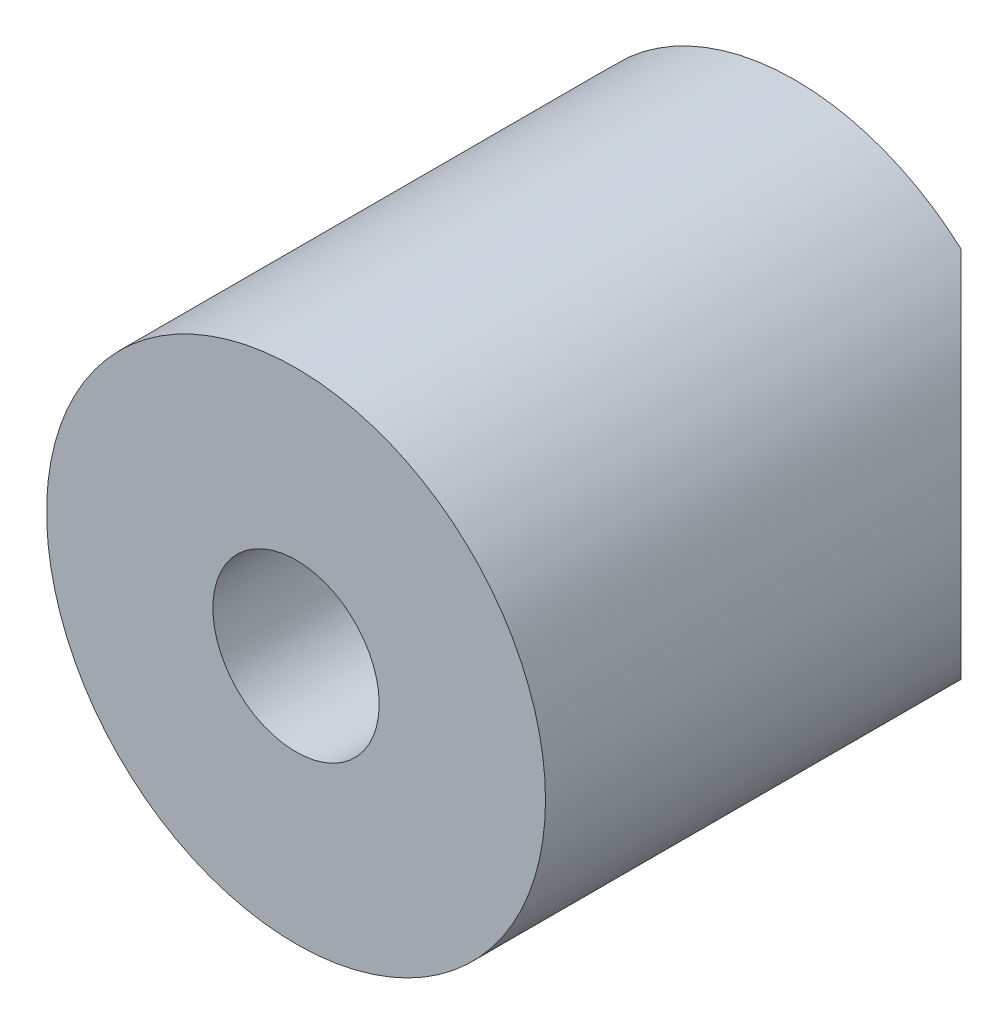
ISO-10303-21;
HEADER;
FILE_DESCRIPTION(('STEP AP214'),'2;1');
FILE_NAME('part.step','',(''),(''),'','','');
FILE_SCHEMA(('AUTOMOTIVE_DESIGN { 1 0 10303 214 1 1 1 1 }'));
ENDSEC;
DATA;
#1=APPLICATION_CONTEXT('core data for automotive mechanical design processes');
#2=APPLICATION_PROTOCOL_DEFINITION('international standard','automotive_design',2000,#1);
#3=PRODUCT_CONTEXT('',#1,'mechanical');
#4=PRODUCT('Part','Part','',(#3));
#5=PRODUCT_RELATED_PRODUCT_CATEGORY('part','',(#4));
#6=PRODUCT_DEFINITION_FORMATION('','',#4);
#7=PRODUCT_DEFINITION_CONTEXT('part definition',#1,'design');
#8=PRODUCT_DEFINITION('design','',#6,#7);
#9=PRODUCT_DEFINITION_SHAPE('','',#8);
#10=(LENGTH_UNIT() NAMED_UNIT(*) SI_UNIT(.MILLI.,.METRE.));
#11=(NAMED_UNIT(*) PLANE_ANGLE_UNIT() SI_UNIT($,.RADIAN.));
#12=(NAMED_UNIT(*) SI_UNIT($,.STERADIAN.) SOLID_ANGLE_UNIT());
#13=UNCERTAINTY_MEASURE_WITH_UNIT(LENGTH_MEASURE(1.E-05),#10,'distance_accuracy_value','');
#14=(GEOMETRIC_REPRESENTATION_CONTEXT(3) GLOBAL_UNCERTAINTY_ASSIGNED_CONTEXT((#13)) GLOBAL_UNIT_ASSIGNED_CONTEXT((#10,
#11,#12)) REPRESENTATION_CONTEXT('',''));
#15=CARTESIAN_POINT('',(0.,0.,0.));
#16=DIRECTION('',(0.,0.,1.));
#17=DIRECTION('',(1.,0.,0.));
#18=AXIS2_PLACEMENT_3D('',#15,#16,#17);
#19=CARTESIAN_POINT('',(0.,0.,-76.2));
#20=DIRECTION('',(0.,0.,1.));
#21=DIRECTION('',(1.,0.,0.));
#22=AXIS2_PLACEMENT_3D('',#19,#20,#21);
#23=CYLINDRICAL_SURFACE('',#22,38.1);
#24=CARTESIAN_POINT('',(0.,0.,-101.6));
#25=DIRECTION('',(0.707106781186543,0.,0.707106781186552));
#26=DIRECTION('',(-0.707106781186552,0.,0.707106781186543));
#27=AXIS2_PLACEMENT_3D('',#24,#25,#26);
#28=ELLIPSE('',#27,53.8815367264146,38.1);
#29=CARTESIAN_POINT('',(-25.4,-28.3980633142473,-76.2));
#30=VERTEX_POINT('',#29);
#31=CARTESIAN_POINT('',(-25.4,28.3980633142473,-76.2));
#32=VERTEX_POINT('',#31);
#33=EDGE_CURVE('E53',#30,#32,#28,.F.);
#34=ORIENTED_EDGE('',*,*,#33,.F.);
#35=CARTESIAN_POINT('',(0.,0.,-76.2));
#36=DIRECTION('',(0.,0.,1.));
#37=DIRECTION('',(1.,0.,0.));
#38=AXIS2_PLACEMENT_3D('',#35,#36,#37);
#39=CIRCLE('',#38,38.1);
#40=CARTESIAN_POINT('',(25.4,-28.3980633142473,-76.2));
#41=VERTEX_POINT('',#40);
#42=EDGE_CURVE('E64',#30,#41,#39,.T.);
#43=ORIENTED_EDGE('',*,*,#42,.T.);
#44=CARTESIAN_POINT('',(0.,0.,-101.6));
#45=DIRECTION('',(-0.707106781186543,0.,0.707106781186552));
#46=DIRECTION('',(0.707106781186552,0.,0.707106781186543));
#47=AXIS2_PLACEMENT_3D('',#44,#45,#46);
#48=ELLIPSE('',#47,53.8815367264146,38.1);
#49=CARTESIAN_POINT('',(25.4,28.3980633142473,-76.2));
#50=VERTEX_POINT('',#49);
#51=EDGE_CURVE('E46',#50,#41,#48,.F.);
#52=ORIENTED_EDGE('',*,*,#51,.F.);
#53=EDGE_CURVE('E62',#50,#32,#39,.T.);
#54=ORIENTED_EDGE('',*,*,#53,.T.);
#55=EDGE_LOOP('',(#34,#43,#52,#54));
#56=FACE_BOUND('',#55,.T.);
#57=CARTESIAN_POINT('',(0.,0.,0.));
#58=DIRECTION('',(0.,0.,1.));
#59=DIRECTION('',(1.,0.,0.));
#60=AXIS2_PLACEMENT_3D('',#57,#58,#59);
#61=CIRCLE('',#60,38.1);
#62=CARTESIAN_POINT('',(38.1,0.,0.));
#63=VERTEX_POINT('',#62);
#64=EDGE_CURVE('E70',#63,#63,#61,.T.);
#65=ORIENTED_EDGE('',*,*,#64,.F.);
#66=EDGE_LOOP('',(#65));
#67=FACE_BOUND('',#66,.T.);
#68=ADVANCED_FACE('F33',(#56,#67),#23,.T.);
#69=CARTESIAN_POINT('',(0.,0.,-76.2));
#70=DIRECTION('',(0.,0.,1.));
#71=DIRECTION('',(1.,0.,0.));
#72=AXIS2_PLACEMENT_3D('',#69,#70,#71);
#73=PLANE('',#72);
#74=CARTESIAN_POINT('',(0.,0.,-76.2));
#75=DIRECTION('',(0.,0.,1.));
#76=DIRECTION('',(1.,0.,0.));
#77=AXIS2_PLACEMENT_3D('',#74,#75,#76);
#78=CIRCLE('',#77,12.7);
#79=CARTESIAN_POINT('',(12.7,0.,-76.2));
#80=VERTEX_POINT('',#79);
#81=EDGE_CURVE('E76',#80,#80,#78,.T.);
#82=ORIENTED_EDGE('',*,*,#81,.T.);
#83=EDGE_LOOP('',(#82));
#84=FACE_BOUND('',#83,.T.);
#85=ORIENTED_EDGE('',*,*,#42,.F.);
#86=DIRECTION('',(0.,1.,0.));
#87=VECTOR('',#86,1.);
#88=CARTESIAN_POINT('',(-25.4,0.,-76.2));
#89=LINE('',#88,#87);
#90=EDGE_CURVE('E11',#30,#32,#89,.T.);
#91=ORIENTED_EDGE('',*,*,#90,.T.);
#92=ORIENTED_EDGE('',*,*,#53,.F.);
#93=DIRECTION('',(0.,-1.,0.));
#94=VECTOR('',#93,1.);
#95=CARTESIAN_POINT('',(25.4,0.,-76.2));
#96=LINE('',#95,#94);
#97=EDGE_CURVE('E40',#50,#41,#96,.T.);
#98=ORIENTED_EDGE('',*,*,#97,.T.);
#99=EDGE_LOOP('',(#85,#91,#92,#98));
#100=FACE_BOUND('',#99,.T.);
#101=ADVANCED_FACE('F68',(#84,#100),#73,.F.);
#102=CARTESIAN_POINT('',(0.,0.,0.));
#103=DIRECTION('',(0.,0.,1.));
#104=DIRECTION('',(1.,0.,0.));
#105=AXIS2_PLACEMENT_3D('',#102,#103,#104);
#106=PLANE('',#105);
#107=CARTESIAN_POINT('',(0.,0.,0.));
#108=DIRECTION('',(0.,0.,1.));
#109=DIRECTION('',(1.,0.,0.));
#110=AXIS2_PLACEMENT_3D('',#107,#108,#109);
#111=CIRCLE('',#110,12.7);
#112=CARTESIAN_POINT('',(12.7,0.,0.));
#113=VERTEX_POINT('',#112);
#114=EDGE_CURVE('E73',#113,#113,#111,.T.);
#115=ORIENTED_EDGE('',*,*,#114,.F.);
#116=EDGE_LOOP('',(#115));
#117=FACE_BOUND('',#116,.T.);
#118=ORIENTED_EDGE('',*,*,#64,.T.);
#119=EDGE_LOOP('',(#118));
#120=FACE_BOUND('',#119,.T.);
#121=ADVANCED_FACE('F88',(#117,#120),#106,.T.);
#122=CARTESIAN_POINT('',(0.,0.,-76.2));
#123=DIRECTION('',(0.,0.,1.));
#124=DIRECTION('',(1.,0.,0.));
#125=AXIS2_PLACEMENT_3D('',#122,#123,#124);
#126=CYLINDRICAL_SURFACE('',#125,12.7);
#127=CARTESIAN_POINT('',(12.7,0.,-76.2));
#128=CARTESIAN_POINT('',(12.7,0.,-75.40625));
#129=CARTESIAN_POINT('',(12.7,0.,-74.6125));
#130=CARTESIAN_POINT('',(12.7,0.,-73.025));
#131=CARTESIAN_POINT('',(12.7,0.,-72.23125));
#132=CARTESIAN_POINT('',(12.7,0.,-70.64375));
#133=CARTESIAN_POINT('',(12.7,0.,-69.85));
#134=CARTESIAN_POINT('',(12.7,0.,-68.2625));
#135=CARTESIAN_POINT('',(12.7,0.,-67.46875));
#136=CARTESIAN_POINT('',(12.7,0.,-65.88125));
#137=CARTESIAN_POINT('',(12.7,0.,-65.0875));
#138=CARTESIAN_POINT('',(12.7,0.,-63.5));
#139=CARTESIAN_POINT('',(12.7,0.,-62.70625));
#140=CARTESIAN_POINT('',(12.7,0.,-61.11875));
#141=CARTESIAN_POINT('',(12.7,0.,-60.325));
#142=CARTESIAN_POINT('',(12.7,0.,-58.7375));
#143=CARTESIAN_POINT('',(12.7,0.,-57.94375));
#144=CARTESIAN_POINT('',(12.7,0.,-56.35625));
#145=CARTESIAN_POINT('',(12.7,0.,-55.5625));
#146=CARTESIAN_POINT('',(12.7,0.,-53.975));
#147=CARTESIAN_POINT('',(12.7,0.,-53.18125));
#148=CARTESIAN_POINT('',(12.7,0.,-51.59375));
#149=CARTESIAN_POINT('',(12.7,0.,-50.8));
#150=CARTESIAN_POINT('',(12.7,0.,-49.2125));
#151=CARTESIAN_POINT('',(12.7,0.,-48.41875));
#152=CARTESIAN_POINT('',(12.7,0.,-46.83125));
#153=CARTESIAN_POINT('',(12.7,0.,-46.0375));
#154=CARTESIAN_POINT('',(12.7,0.,-44.45));
#155=CARTESIAN_POINT('',(12.7,0.,-43.65625));
#156=CARTESIAN_POINT('',(12.7,0.,-42.06875));
#157=CARTESIAN_POINT('',(12.7,0.,-41.275));
#158=CARTESIAN_POINT('',(12.7,0.,-39.6875));
#159=CARTESIAN_POINT('',(12.7,0.,-38.89375));
#160=CARTESIAN_POINT('',(12.7,0.,-37.30625));
#161=CARTESIAN_POINT('',(12.7,0.,-36.5125));
#162=CARTESIAN_POINT('',(12.7,0.,-34.925));
#163=CARTESIAN_POINT('',(12.7,0.,-34.13125));
#164=CARTESIAN_POINT('',(12.7,0.,-32.54375));
#165=CARTESIAN_POINT('',(12.7,0.,-31.75));
#166=CARTESIAN_POINT('',(12.7,0.,-30.1625));
#167=CARTESIAN_POINT('',(12.7,0.,-29.36875));
#168=CARTESIAN_POINT('',(12.7,0.,-27.78125));
#169=CARTESIAN_POINT('',(12.7,0.,-26.9875));
#170=CARTESIAN_POINT('',(12.7,0.,-25.4));
#171=CARTESIAN_POINT('',(12.7,0.,-24.60625));
#172=CARTESIAN_POINT('',(12.7,0.,-23.01875));
#173=CARTESIAN_POINT('',(12.7,0.,-22.225));
#174=CARTESIAN_POINT('',(12.7,0.,-20.6375));
#175=CARTESIAN_POINT('',(12.7,0.,-19.84375));
#176=CARTESIAN_POINT('',(12.7,0.,-18.25625));
#177=CARTESIAN_POINT('',(12.7,0.,-17.4625));
#178=CARTESIAN_POINT('',(12.7,0.,-15.875));
#179=CARTESIAN_POINT('',(12.7,0.,-15.08125));
#180=CARTESIAN_POINT('',(12.7,0.,-13.49375));
#181=CARTESIAN_POINT('',(12.7,0.,-12.7));
#182=CARTESIAN_POINT('',(12.7,0.,-11.1125));
#183=CARTESIAN_POINT('',(12.7,0.,-10.31875));
#184=CARTESIAN_POINT('',(12.7,0.,-8.73125));
#185=CARTESIAN_POINT('',(12.7,0.,-7.93750000000001));
#186=CARTESIAN_POINT('',(12.7,0.,-6.35));
#187=CARTESIAN_POINT('',(12.7,0.,-5.55625));
#188=CARTESIAN_POINT('',(12.7,0.,-3.96875));
#189=CARTESIAN_POINT('',(12.7,0.,-3.175));
#190=CARTESIAN_POINT('',(12.7,0.,-1.5875));
#191=CARTESIAN_POINT('',(12.7,0.,-0.793750000000001));
#192=CARTESIAN_POINT('',(12.7,0.,0.));
#193=B_SPLINE_CURVE_WITH_KNOTS('',3,(#127,#128,#129,#130,#131,#132,#133,#134,#135,#136,#137,
#138,#139,#140,#141,#142,#143,#144,#145,#146,#147,#148,#149,#150,#151,#152,#153,#154,#155,#156,
#157,#158,#159,#160,#161,#162,#163,#164,#165,#166,#167,#168,#169,#170,#171,#172,#173,#174,#175,
#176,#177,#178,#179,#180,#181,#182,#183,#184,#185,#186,#187,#188,#189,#190,#191,#192),
.UNSPECIFIED.,.F.,.F.,(4,2,2,2,2,2,2,2,2,2,2,2,2,2,2,2,2,2,2,2,2,2,2,2,2,2,2,2,2,2,2,2,4),(0.,
2.38125,4.7625,7.14375,9.52500000000001,11.90625,14.2875,16.66875,19.05,21.43125,23.8125,
26.19375,28.575,30.95625,33.3375,35.71875,38.1,40.48125,42.8625,45.24375,47.625,50.00625,
52.3875,54.76875,57.15,59.53125,61.9125,64.29375,66.675,69.05625,71.4375,73.81875,76.2),.UNSPECIFIED.);
#194=EDGE_CURVE('BSEAM86',#80,#113,#193,.T.);
#195=ORIENTED_EDGE('',*,*,#81,.F.);
#196=ORIENTED_EDGE('',*,*,#114,.T.);
#197=ORIENTED_EDGE('',*,*,#194,.T.);
#198=ORIENTED_EDGE('',*,*,#194,.F.);
#199=EDGE_LOOP('',(#195,#197,#196,#198));
#200=FACE_BOUND('',#199,.T.);
#201=ADVANCED_FACE('F86',(#200),#126,.F.);
#202=CARTESIAN_POINT('',(25.4,-38.1,-76.2));
#203=DIRECTION('',(-0.707106781186543,0.,0.707106781186552));
#204=DIRECTION('',(0.707106781186552,0.,0.707106781186543));
#205=AXIS2_PLACEMENT_3D('',#202,#203,#204);
#206=PLANE('',#205);
#207=ORIENTED_EDGE('',*,*,#51,.T.);
#208=ORIENTED_EDGE('',*,*,#97,.F.);
#209=EDGE_LOOP('',(#207,#208));
#210=FACE_BOUND('',#209,.T.);
#211=ADVANCED_FACE('F66',(#210),#206,.F.);
#212=CARTESIAN_POINT('',(-25.4,-38.1,-76.2));
#213=DIRECTION('',(0.707106781186543,0.,0.707106781186552));
#214=DIRECTION('',(0.707106781186552,0.,-0.707106781186543));
#215=AXIS2_PLACEMENT_3D('',#212,#213,#214);
#216=PLANE('',#215);
#217=ORIENTED_EDGE('',*,*,#33,.T.);
#218=ORIENTED_EDGE('',*,*,#90,.F.);
#219=EDGE_LOOP('',(#217,#218));
#220=FACE_BOUND('',#219,.T.);
#221=ADVANCED_FACE('F115',(#220),#216,.F.);
#222=CLOSED_SHELL('',(#68,#101,#121,#201,#211,#221));
#223=MANIFOLD_SOLID_BREP('B2',#222);
#224=ADVANCED_BREP_SHAPE_REPRESENTATION('',(#18,#223),#14);
#225=SHAPE_DEFINITION_REPRESENTATION(#9,#224);
ENDSEC;
END-ISO-10303-21;
